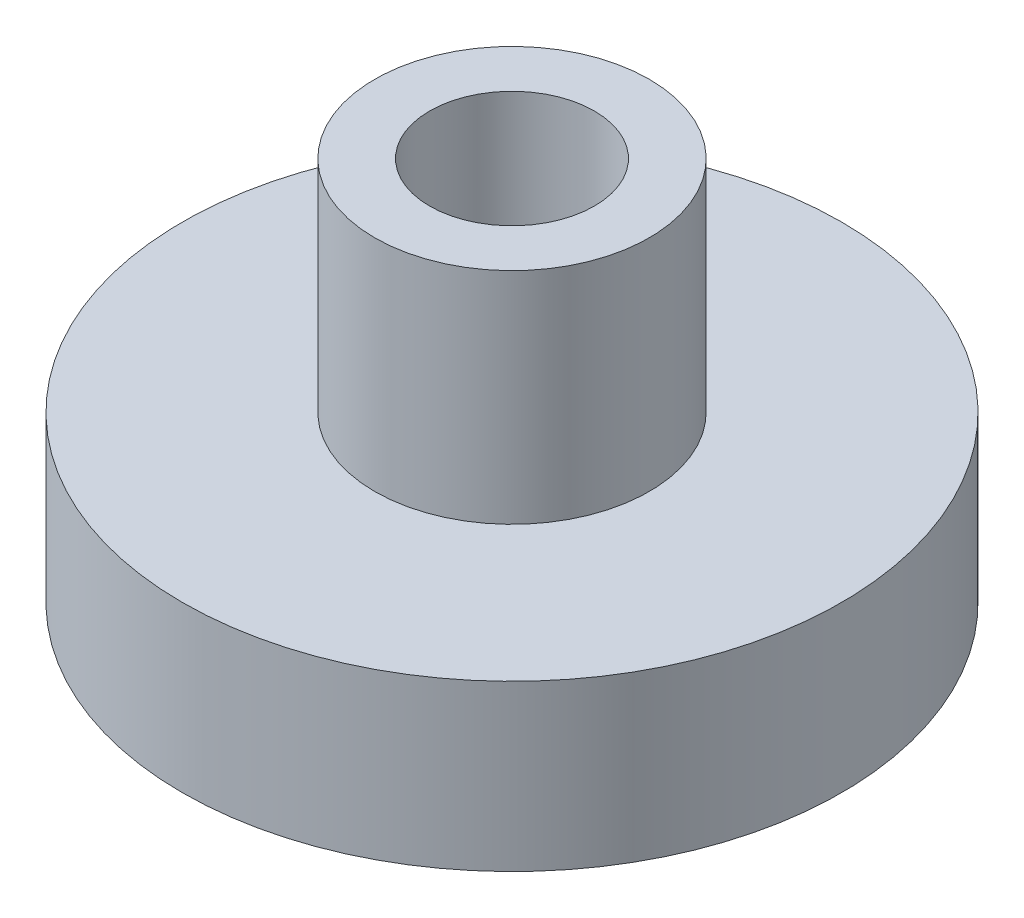
ISO-10303-21;
HEADER;
FILE_DESCRIPTION(('STEP AP214'),'2;1');
FILE_NAME('part.step','',(''),(''),'','','');
FILE_SCHEMA(('AUTOMOTIVE_DESIGN { 1 0 10303 214 1 1 1 1 }'));
ENDSEC;
DATA;
#1=APPLICATION_CONTEXT('core data for automotive mechanical design processes');
#2=APPLICATION_PROTOCOL_DEFINITION('international standard','automotive_design',2000,#1);
#3=PRODUCT_CONTEXT('',#1,'mechanical');
#4=PRODUCT('Part','Part','',(#3));
#5=PRODUCT_RELATED_PRODUCT_CATEGORY('part','',(#4));
#6=PRODUCT_DEFINITION_FORMATION('','',#4);
#7=PRODUCT_DEFINITION_CONTEXT('part definition',#1,'design');
#8=PRODUCT_DEFINITION('design','',#6,#7);
#9=PRODUCT_DEFINITION_SHAPE('','',#8);
#10=(LENGTH_UNIT() NAMED_UNIT(*) SI_UNIT(.MILLI.,.METRE.));
#11=(NAMED_UNIT(*) PLANE_ANGLE_UNIT() SI_UNIT($,.RADIAN.));
#12=(NAMED_UNIT(*) SI_UNIT($,.STERADIAN.) SOLID_ANGLE_UNIT());
#13=UNCERTAINTY_MEASURE_WITH_UNIT(LENGTH_MEASURE(1.E-05),#10,'distance_accuracy_value','');
#14=(GEOMETRIC_REPRESENTATION_CONTEXT(3) GLOBAL_UNCERTAINTY_ASSIGNED_CONTEXT((#13)) GLOBAL_UNIT_ASSIGNED_CONTEXT((#10,
#11,#12)) REPRESENTATION_CONTEXT('',''));
#15=CARTESIAN_POINT('',(0.,0.,0.));
#16=DIRECTION('',(0.,0.,1.));
#17=DIRECTION('',(1.,0.,0.));
#18=AXIS2_PLACEMENT_3D('',#15,#16,#17);
#19=CARTESIAN_POINT('',(0.,4.,0.));
#20=DIRECTION('',(0.,1.,0.));
#21=DIRECTION('',(0.,0.,1.));
#22=AXIS2_PLACEMENT_3D('',#19,#20,#21);
#23=PLANE('',#22);
#24=CARTESIAN_POINT('',(0.,4.,0.));
#25=DIRECTION('',(0.,1.,0.));
#26=DIRECTION('',(0.,0.,1.));
#27=AXIS2_PLACEMENT_3D('',#24,#25,#26);
#28=CIRCLE('',#27,2.5);
#29=CARTESIAN_POINT('',(0.,4.,2.5));
#30=VERTEX_POINT('',#29);
#31=EDGE_CURVE('E10',#30,#30,#28,.T.);
#32=ORIENTED_EDGE('',*,*,#31,.T.);
#33=EDGE_LOOP('',(#32));
#34=FACE_BOUND('',#33,.T.);
#35=CARTESIAN_POINT('',(0.,4.,0.));
#36=DIRECTION('',(0.,1.,0.));
#37=DIRECTION('',(0.,0.,1.));
#38=AXIS2_PLACEMENT_3D('',#35,#36,#37);
#39=CIRCLE('',#38,1.5);
#40=CARTESIAN_POINT('',(0.,4.,1.5));
#41=VERTEX_POINT('',#40);
#42=EDGE_CURVE('E50',#41,#41,#39,.T.);
#43=ORIENTED_EDGE('',*,*,#42,.F.);
#44=EDGE_LOOP('',(#43));
#45=FACE_BOUND('',#44,.T.);
#46=ADVANCED_FACE('F41',(#34,#45),#23,.T.);
#47=CARTESIAN_POINT('',(0.,4.,0.));
#48=DIRECTION('',(0.,-1.,0.));
#49=DIRECTION('',(0.,0.,-1.));
#50=AXIS2_PLACEMENT_3D('',#47,#48,#49);
#51=CYLINDRICAL_SURFACE('',#50,2.5);
#52=ORIENTED_EDGE('',*,*,#31,.F.);
#53=EDGE_LOOP('',(#52));
#54=FACE_BOUND('',#53,.T.);
#55=CARTESIAN_POINT('',(0.,0.,0.));
#56=DIRECTION('',(0.,1.,0.));
#57=DIRECTION('',(0.,0.,1.));
#58=AXIS2_PLACEMENT_3D('',#55,#56,#57);
#59=CIRCLE('',#58,2.5);
#60=CARTESIAN_POINT('',(0.,0.,2.5));
#61=VERTEX_POINT('',#60);
#62=EDGE_CURVE('E45',#61,#61,#59,.T.);
#63=ORIENTED_EDGE('',*,*,#62,.T.);
#64=EDGE_LOOP('',(#63));
#65=FACE_BOUND('',#64,.T.);
#66=ADVANCED_FACE('F43',(#54,#65),#51,.T.);
#67=CARTESIAN_POINT('',(0.,4.,0.));
#68=DIRECTION('',(0.,-1.,0.));
#69=DIRECTION('',(0.,0.,-1.));
#70=AXIS2_PLACEMENT_3D('',#67,#68,#69);
#71=CYLINDRICAL_SURFACE('',#70,1.5);
#72=ORIENTED_EDGE('',*,*,#42,.T.);
#73=EDGE_LOOP('',(#72));
#74=FACE_BOUND('',#73,.T.);
#75=CARTESIAN_POINT('',(0.,-3.,0.));
#76=DIRECTION('',(0.,-1.,0.));
#77=DIRECTION('',(0.,0.,-1.));
#78=AXIS2_PLACEMENT_3D('',#75,#76,#77);
#79=CIRCLE('',#78,1.5);
#80=CARTESIAN_POINT('',(0.,-3.,-1.5));
#81=VERTEX_POINT('',#80);
#82=EDGE_CURVE('E62',#81,#81,#79,.T.);
#83=ORIENTED_EDGE('',*,*,#82,.T.);
#84=EDGE_LOOP('',(#83));
#85=FACE_BOUND('',#84,.T.);
#86=ADVANCED_FACE('F70',(#74,#85),#71,.F.);
#87=CARTESIAN_POINT('',(0.,-3.,0.));
#88=DIRECTION('',(0.,-1.,0.));
#89=DIRECTION('',(0.,0.,-1.));
#90=AXIS2_PLACEMENT_3D('',#87,#88,#89);
#91=PLANE('',#90);
#92=CARTESIAN_POINT('',(0.,-3.,0.));
#93=DIRECTION('',(0.,-1.,0.));
#94=DIRECTION('',(0.,0.,-1.));
#95=AXIS2_PLACEMENT_3D('',#92,#93,#94);
#96=CIRCLE('',#95,6.);
#97=CARTESIAN_POINT('',(0.,-3.,-6.));
#98=VERTEX_POINT('',#97);
#99=EDGE_CURVE('E61',#98,#98,#96,.T.);
#100=ORIENTED_EDGE('',*,*,#99,.T.);
#101=EDGE_LOOP('',(#100));
#102=FACE_BOUND('',#101,.T.);
#103=ORIENTED_EDGE('',*,*,#82,.F.);
#104=EDGE_LOOP('',(#103));
#105=FACE_BOUND('',#104,.T.);
#106=ADVANCED_FACE('F72',(#102,#105),#91,.T.);
#107=CARTESIAN_POINT('',(0.,0.,0.));
#108=DIRECTION('',(0.,-1.,0.));
#109=DIRECTION('',(0.,0.,-1.));
#110=AXIS2_PLACEMENT_3D('',#107,#108,#109);
#111=PLANE('',#110);
#112=ORIENTED_EDGE('',*,*,#62,.F.);
#113=EDGE_LOOP('',(#112));
#114=FACE_BOUND('',#113,.T.);
#115=CARTESIAN_POINT('',(0.,0.,0.));
#116=DIRECTION('',(0.,-1.,0.));
#117=DIRECTION('',(0.,0.,-1.));
#118=AXIS2_PLACEMENT_3D('',#115,#116,#117);
#119=CIRCLE('',#118,6.);
#120=CARTESIAN_POINT('',(0.,0.,-6.));
#121=VERTEX_POINT('',#120);
#122=EDGE_CURVE('E57',#121,#121,#119,.T.);
#123=ORIENTED_EDGE('',*,*,#122,.F.);
#124=EDGE_LOOP('',(#123));
#125=FACE_BOUND('',#124,.T.);
#126=ADVANCED_FACE('F74',(#114,#125),#111,.F.);
#127=CARTESIAN_POINT('',(0.,-3.,0.));
#128=DIRECTION('',(0.,1.,0.));
#129=DIRECTION('',(0.,0.,1.));
#130=AXIS2_PLACEMENT_3D('',#127,#128,#129);
#131=CYLINDRICAL_SURFACE('',#130,6.);
#132=ORIENTED_EDGE('',*,*,#99,.F.);
#133=EDGE_LOOP('',(#132));
#134=FACE_BOUND('',#133,.T.);
#135=ORIENTED_EDGE('',*,*,#122,.T.);
#136=EDGE_LOOP('',(#135));
#137=FACE_BOUND('',#136,.T.);
#138=ADVANCED_FACE('F81',(#134,#137),#131,.T.);
#139=CLOSED_SHELL('',(#46,#66,#86,#106,#126,#138));
#140=MANIFOLD_SOLID_BREP('B2',#139);
#141=ADVANCED_BREP_SHAPE_REPRESENTATION('',(#18,#140),#14);
#142=SHAPE_DEFINITION_REPRESENTATION(#9,#141);
ENDSEC;
END-ISO-10303-21;
